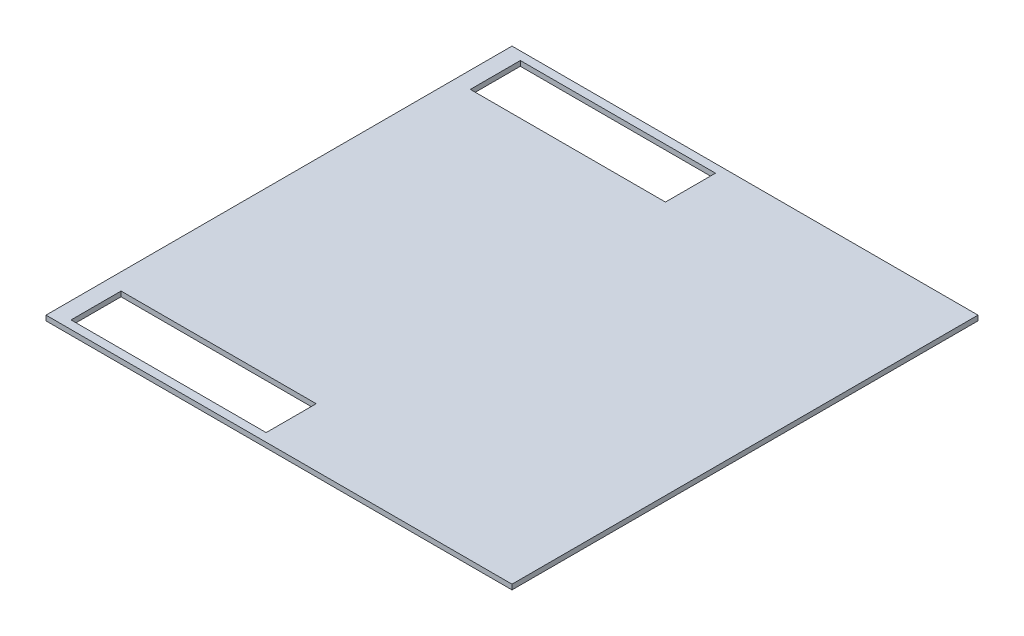
ISO-10303-21;
HEADER;
FILE_DESCRIPTION(('STEP AP214'),'2;1');
FILE_NAME('part.step','',(''),(''),'','','');
FILE_SCHEMA(('AUTOMOTIVE_DESIGN { 1 0 10303 214 1 1 1 1 }'));
ENDSEC;
DATA;
#1=APPLICATION_CONTEXT('core data for automotive mechanical design processes');
#2=APPLICATION_PROTOCOL_DEFINITION('international standard','automotive_design',2000,#1);
#3=PRODUCT_CONTEXT('',#1,'mechanical');
#4=PRODUCT('Part','Part','',(#3));
#5=PRODUCT_RELATED_PRODUCT_CATEGORY('part','',(#4));
#6=PRODUCT_DEFINITION_FORMATION('','',#4);
#7=PRODUCT_DEFINITION_CONTEXT('part definition',#1,'design');
#8=PRODUCT_DEFINITION('design','',#6,#7);
#9=PRODUCT_DEFINITION_SHAPE('','',#8);
#10=(LENGTH_UNIT() NAMED_UNIT(*) SI_UNIT(.MILLI.,.METRE.));
#11=(NAMED_UNIT(*) PLANE_ANGLE_UNIT() SI_UNIT($,.RADIAN.));
#12=(NAMED_UNIT(*) SI_UNIT($,.STERADIAN.) SOLID_ANGLE_UNIT());
#13=UNCERTAINTY_MEASURE_WITH_UNIT(LENGTH_MEASURE(1.E-05),#10,'distance_accuracy_value','');
#14=(GEOMETRIC_REPRESENTATION_CONTEXT(3) GLOBAL_UNCERTAINTY_ASSIGNED_CONTEXT((#13)) GLOBAL_UNIT_ASSIGNED_CONTEXT((#10,
#11,#12)) REPRESENTATION_CONTEXT('',''));
#15=CARTESIAN_POINT('',(0.,0.,0.));
#16=DIRECTION('',(0.,0.,1.));
#17=DIRECTION('',(1.,0.,0.));
#18=AXIS2_PLACEMENT_3D('',#15,#16,#17);
#19=CARTESIAN_POINT('',(0.,3.,0.));
#20=DIRECTION('',(0.,1.,0.));
#21=DIRECTION('',(0.,0.,1.));
#22=AXIS2_PLACEMENT_3D('',#19,#20,#21);
#23=PLANE('',#22);
#24=DIRECTION('',(0.,0.,-1.));
#25=VECTOR('',#24,1.);
#26=CARTESIAN_POINT('',(139.7,3.,-139.7));
#27=LINE('',#26,#25);
#28=CARTESIAN_POINT('',(139.7,3.,139.7));
#29=VERTEX_POINT('',#28);
#30=CARTESIAN_POINT('',(139.7,3.,-139.7));
#31=VERTEX_POINT('',#30);
#32=EDGE_CURVE('E188',#29,#31,#27,.T.);
#33=ORIENTED_EDGE('',*,*,#32,.T.);
#34=DIRECTION('',(-1.,0.,0.));
#35=VECTOR('',#34,1.);
#36=CARTESIAN_POINT('',(-139.7,3.,-139.7));
#37=LINE('',#36,#35);
#38=CARTESIAN_POINT('',(-139.7,3.,-139.7));
#39=VERTEX_POINT('',#38);
#40=EDGE_CURVE('E191',#31,#39,#37,.T.);
#41=ORIENTED_EDGE('',*,*,#40,.T.);
#42=DIRECTION('',(0.,0.,1.));
#43=VECTOR('',#42,1.);
#44=CARTESIAN_POINT('',(-139.7,3.,-139.7));
#45=LINE('',#44,#43);
#46=CARTESIAN_POINT('',(-139.7,3.,139.7));
#47=VERTEX_POINT('',#46);
#48=EDGE_CURVE('E194',#39,#47,#45,.T.);
#49=ORIENTED_EDGE('',*,*,#48,.T.);
#50=DIRECTION('',(1.,0.,0.));
#51=VECTOR('',#50,1.);
#52=CARTESIAN_POINT('',(-139.7,3.,139.7));
#53=LINE('',#52,#51);
#54=EDGE_CURVE('E196',#47,#29,#53,.T.);
#55=ORIENTED_EDGE('',*,*,#54,.T.);
#56=EDGE_LOOP('',(#33,#41,#49,#55));
#57=FACE_BOUND('',#56,.T.);
#58=DIRECTION('',(1.,0.,0.));
#59=VECTOR('',#58,1.);
#60=CARTESIAN_POINT('',(-129.7,3.,-104.7));
#61=LINE('',#60,#59);
#62=CARTESIAN_POINT('',(-129.7,3.,-104.7));
#63=VERTEX_POINT('',#62);
#64=CARTESIAN_POINT('',(-12.7000000000001,3.,-104.7));
#65=VERTEX_POINT('',#64);
#66=EDGE_CURVE('E159',#63,#65,#61,.T.);
#67=ORIENTED_EDGE('',*,*,#66,.F.);
#68=DIRECTION('',(0.,0.,1.));
#69=VECTOR('',#68,1.);
#70=CARTESIAN_POINT('',(-129.7,3.,-134.7));
#71=LINE('',#70,#69);
#72=CARTESIAN_POINT('',(-129.7,3.,-134.7));
#73=VERTEX_POINT('',#72);
#74=EDGE_CURVE('E157',#73,#63,#71,.T.);
#75=ORIENTED_EDGE('',*,*,#74,.F.);
#76=DIRECTION('',(-1.,0.,0.));
#77=VECTOR('',#76,1.);
#78=CARTESIAN_POINT('',(-129.7,3.,-134.7));
#79=LINE('',#78,#77);
#80=CARTESIAN_POINT('',(-12.7000000000001,3.,-134.7));
#81=VERTEX_POINT('',#80);
#82=EDGE_CURVE('E165',#81,#73,#79,.T.);
#83=ORIENTED_EDGE('',*,*,#82,.F.);
#84=DIRECTION('',(0.,0.,-1.));
#85=VECTOR('',#84,1.);
#86=CARTESIAN_POINT('',(-12.7000000000001,3.,-134.7));
#87=LINE('',#86,#85);
#88=EDGE_CURVE('E162',#65,#81,#87,.T.);
#89=ORIENTED_EDGE('',*,*,#88,.F.);
#90=EDGE_LOOP('',(#67,#75,#83,#89));
#91=FACE_BOUND('',#90,.T.);
#92=DIRECTION('',(1.,0.,0.));
#93=VECTOR('',#92,1.);
#94=CARTESIAN_POINT('',(-129.7,3.,134.7));
#95=LINE('',#94,#93);
#96=CARTESIAN_POINT('',(-129.7,3.,134.7));
#97=VERTEX_POINT('',#96);
#98=CARTESIAN_POINT('',(-12.7000000000001,3.,134.7));
#99=VERTEX_POINT('',#98);
#100=EDGE_CURVE('E129',#97,#99,#95,.T.);
#101=ORIENTED_EDGE('',*,*,#100,.F.);
#102=DIRECTION('',(0.,0.,1.));
#103=VECTOR('',#102,1.);
#104=CARTESIAN_POINT('',(-129.7,3.,134.7));
#105=LINE('',#104,#103);
#106=CARTESIAN_POINT('',(-129.7,3.,104.7));
#107=VERTEX_POINT('',#106);
#108=EDGE_CURVE('E121',#107,#97,#105,.T.);
#109=ORIENTED_EDGE('',*,*,#108,.F.);
#110=DIRECTION('',(-1.,0.,0.));
#111=VECTOR('',#110,1.);
#112=CARTESIAN_POINT('',(-129.7,3.,104.7));
#113=LINE('',#112,#111);
#114=CARTESIAN_POINT('',(-12.7000000000001,3.,104.7));
#115=VERTEX_POINT('',#114);
#116=EDGE_CURVE('E143',#115,#107,#113,.T.);
#117=ORIENTED_EDGE('',*,*,#116,.F.);
#118=DIRECTION('',(0.,0.,-1.));
#119=VECTOR('',#118,1.);
#120=CARTESIAN_POINT('',(-12.7000000000001,3.,134.7));
#121=LINE('',#120,#119);
#122=EDGE_CURVE('E141',#99,#115,#121,.T.);
#123=ORIENTED_EDGE('',*,*,#122,.F.);
#124=EDGE_LOOP('',(#101,#109,#117,#123));
#125=FACE_BOUND('',#124,.T.);
#126=ADVANCED_FACE('F32',(#57,#91,#125),#23,.T.);
#127=CARTESIAN_POINT('',(0.,0.,0.));
#128=DIRECTION('',(0.,1.,0.));
#129=DIRECTION('',(0.,0.,1.));
#130=AXIS2_PLACEMENT_3D('',#127,#128,#129);
#131=PLANE('',#130);
#132=DIRECTION('',(0.,0.,1.));
#133=VECTOR('',#132,1.);
#134=CARTESIAN_POINT('',(-129.7,0.,-134.7));
#135=LINE('',#134,#133);
#136=CARTESIAN_POINT('',(-129.7,0.,-134.7));
#137=VERTEX_POINT('',#136);
#138=CARTESIAN_POINT('',(-129.7,0.,-104.7));
#139=VERTEX_POINT('',#138);
#140=EDGE_CURVE('E137',#137,#139,#135,.T.);
#141=ORIENTED_EDGE('',*,*,#140,.T.);
#142=DIRECTION('',(1.,0.,0.));
#143=VECTOR('',#142,1.);
#144=CARTESIAN_POINT('',(-129.7,0.,-104.7));
#145=LINE('',#144,#143);
#146=CARTESIAN_POINT('',(-12.7000000000001,0.,-104.7));
#147=VERTEX_POINT('',#146);
#148=EDGE_CURVE('E170',#139,#147,#145,.T.);
#149=ORIENTED_EDGE('',*,*,#148,.T.);
#150=DIRECTION('',(0.,0.,-1.));
#151=VECTOR('',#150,1.);
#152=CARTESIAN_POINT('',(-12.7000000000001,0.,-134.7));
#153=LINE('',#152,#151);
#154=CARTESIAN_POINT('',(-12.7000000000001,0.,-134.7));
#155=VERTEX_POINT('',#154);
#156=EDGE_CURVE('E173',#147,#155,#153,.T.);
#157=ORIENTED_EDGE('',*,*,#156,.T.);
#158=DIRECTION('',(-1.,0.,0.));
#159=VECTOR('',#158,1.);
#160=CARTESIAN_POINT('',(-129.7,0.,-134.7));
#161=LINE('',#160,#159);
#162=EDGE_CURVE('E160',#155,#137,#161,.T.);
#163=ORIENTED_EDGE('',*,*,#162,.T.);
#164=EDGE_LOOP('',(#141,#149,#157,#163));
#165=FACE_BOUND('',#164,.T.);
#166=DIRECTION('',(0.,0.,-1.));
#167=VECTOR('',#166,1.);
#168=CARTESIAN_POINT('',(139.7,0.,-139.7));
#169=LINE('',#168,#167);
#170=CARTESIAN_POINT('',(139.7,0.,139.7));
#171=VERTEX_POINT('',#170);
#172=CARTESIAN_POINT('',(139.7,0.,-139.7));
#173=VERTEX_POINT('',#172);
#174=EDGE_CURVE('E187',#171,#173,#169,.T.);
#175=ORIENTED_EDGE('',*,*,#174,.F.);
#176=DIRECTION('',(1.,0.,0.));
#177=VECTOR('',#176,1.);
#178=CARTESIAN_POINT('',(-139.7,0.,139.7));
#179=LINE('',#178,#177);
#180=CARTESIAN_POINT('',(-139.7,0.,139.7));
#181=VERTEX_POINT('',#180);
#182=EDGE_CURVE('E192',#181,#171,#179,.T.);
#183=ORIENTED_EDGE('',*,*,#182,.F.);
#184=DIRECTION('',(0.,0.,1.));
#185=VECTOR('',#184,1.);
#186=CARTESIAN_POINT('',(-139.7,0.,-139.7));
#187=LINE('',#186,#185);
#188=CARTESIAN_POINT('',(-139.7,0.,-139.7));
#189=VERTEX_POINT('',#188);
#190=EDGE_CURVE('E203',#189,#181,#187,.T.);
#191=ORIENTED_EDGE('',*,*,#190,.F.);
#192=DIRECTION('',(-1.,0.,0.));
#193=VECTOR('',#192,1.);
#194=CARTESIAN_POINT('',(-139.7,0.,-139.7));
#195=LINE('',#194,#193);
#196=EDGE_CURVE('E201',#173,#189,#195,.T.);
#197=ORIENTED_EDGE('',*,*,#196,.F.);
#198=EDGE_LOOP('',(#175,#183,#191,#197));
#199=FACE_BOUND('',#198,.T.);
#200=DIRECTION('',(0.,0.,1.));
#201=VECTOR('',#200,1.);
#202=CARTESIAN_POINT('',(-129.7,0.,134.7));
#203=LINE('',#202,#201);
#204=CARTESIAN_POINT('',(-129.7,0.,104.7));
#205=VERTEX_POINT('',#204);
#206=CARTESIAN_POINT('',(-129.7,0.,134.7));
#207=VERTEX_POINT('',#206);
#208=EDGE_CURVE('E55',#205,#207,#203,.T.);
#209=ORIENTED_EDGE('',*,*,#208,.T.);
#210=DIRECTION('',(1.,0.,0.));
#211=VECTOR('',#210,1.);
#212=CARTESIAN_POINT('',(-129.7,0.,134.7));
#213=LINE('',#212,#211);
#214=CARTESIAN_POINT('',(-12.7000000000001,0.,134.7));
#215=VERTEX_POINT('',#214);
#216=EDGE_CURVE('E136',#207,#215,#213,.T.);
#217=ORIENTED_EDGE('',*,*,#216,.T.);
#218=DIRECTION('',(0.,0.,-1.));
#219=VECTOR('',#218,1.);
#220=CARTESIAN_POINT('',(-12.7000000000001,0.,134.7));
#221=LINE('',#220,#219);
#222=CARTESIAN_POINT('',(-12.7000000000001,0.,104.7));
#223=VERTEX_POINT('',#222);
#224=EDGE_CURVE('E149',#215,#223,#221,.T.);
#225=ORIENTED_EDGE('',*,*,#224,.T.);
#226=DIRECTION('',(-1.,0.,0.));
#227=VECTOR('',#226,1.);
#228=CARTESIAN_POINT('',(-129.7,0.,104.7));
#229=LINE('',#228,#227);
#230=EDGE_CURVE('E130',#223,#205,#229,.T.);
#231=ORIENTED_EDGE('',*,*,#230,.T.);
#232=EDGE_LOOP('',(#209,#217,#225,#231));
#233=FACE_BOUND('',#232,.T.);
#234=ADVANCED_FACE('F221',(#165,#199,#233),#131,.F.);
#235=CARTESIAN_POINT('',(139.7,3.,-139.7));
#236=DIRECTION('',(-1.,0.,0.));
#237=DIRECTION('',(0.,0.,1.));
#238=AXIS2_PLACEMENT_3D('',#235,#236,#237);
#239=PLANE('',#238);
#240=ORIENTED_EDGE('',*,*,#174,.T.);
#241=DIRECTION('',(0.,-1.,0.));
#242=VECTOR('',#241,1.);
#243=CARTESIAN_POINT('',(139.7,3.,-139.7));
#244=LINE('',#243,#242);
#245=EDGE_CURVE('E11',#31,#173,#244,.T.);
#246=ORIENTED_EDGE('',*,*,#245,.F.);
#247=ORIENTED_EDGE('',*,*,#32,.F.);
#248=DIRECTION('',(0.,-1.,0.));
#249=VECTOR('',#248,1.);
#250=CARTESIAN_POINT('',(139.7,3.,139.7));
#251=LINE('',#250,#249);
#252=EDGE_CURVE('E198',#29,#171,#251,.T.);
#253=ORIENTED_EDGE('',*,*,#252,.T.);
#254=EDGE_LOOP('',(#240,#246,#247,#253));
#255=FACE_BOUND('',#254,.T.);
#256=ADVANCED_FACE('F34',(#255),#239,.F.);
#257=CARTESIAN_POINT('',(-139.7,3.,-139.7));
#258=DIRECTION('',(0.,0.,1.));
#259=DIRECTION('',(1.,0.,0.));
#260=AXIS2_PLACEMENT_3D('',#257,#258,#259);
#261=PLANE('',#260);
#262=ORIENTED_EDGE('',*,*,#196,.T.);
#263=DIRECTION('',(0.,-1.,0.));
#264=VECTOR('',#263,1.);
#265=CARTESIAN_POINT('',(-139.7,3.,-139.7));
#266=LINE('',#265,#264);
#267=EDGE_CURVE('E40',#39,#189,#266,.T.);
#268=ORIENTED_EDGE('',*,*,#267,.F.);
#269=ORIENTED_EDGE('',*,*,#40,.F.);
#270=ORIENTED_EDGE('',*,*,#245,.T.);
#271=EDGE_LOOP('',(#262,#268,#269,#270));
#272=FACE_BOUND('',#271,.T.);
#273=ADVANCED_FACE('F232',(#272),#261,.F.);
#274=CARTESIAN_POINT('',(-139.7,3.,-139.7));
#275=DIRECTION('',(1.,0.,0.));
#276=DIRECTION('',(0.,0.,-1.));
#277=AXIS2_PLACEMENT_3D('',#274,#275,#276);
#278=PLANE('',#277);
#279=ORIENTED_EDGE('',*,*,#190,.T.);
#280=DIRECTION('',(0.,-1.,0.));
#281=VECTOR('',#280,1.);
#282=CARTESIAN_POINT('',(-139.7,3.,139.7));
#283=LINE('',#282,#281);
#284=EDGE_CURVE('E208',#47,#181,#283,.T.);
#285=ORIENTED_EDGE('',*,*,#284,.F.);
#286=ORIENTED_EDGE('',*,*,#48,.F.);
#287=ORIENTED_EDGE('',*,*,#267,.T.);
#288=EDGE_LOOP('',(#279,#285,#286,#287));
#289=FACE_BOUND('',#288,.T.);
#290=ADVANCED_FACE('F215',(#289),#278,.F.);
#291=CARTESIAN_POINT('',(-139.7,3.,139.7));
#292=DIRECTION('',(0.,0.,-1.));
#293=DIRECTION('',(-1.,0.,0.));
#294=AXIS2_PLACEMENT_3D('',#291,#292,#293);
#295=PLANE('',#294);
#296=ORIENTED_EDGE('',*,*,#182,.T.);
#297=ORIENTED_EDGE('',*,*,#252,.F.);
#298=ORIENTED_EDGE('',*,*,#54,.F.);
#299=ORIENTED_EDGE('',*,*,#284,.T.);
#300=EDGE_LOOP('',(#296,#297,#298,#299));
#301=FACE_BOUND('',#300,.T.);
#302=ADVANCED_FACE('F225',(#301),#295,.F.);
#303=CARTESIAN_POINT('',(-129.7,3.,-134.7));
#304=DIRECTION('',(1.,0.,0.));
#305=DIRECTION('',(0.,0.,-1.));
#306=AXIS2_PLACEMENT_3D('',#303,#304,#305);
#307=PLANE('',#306);
#308=ORIENTED_EDGE('',*,*,#140,.F.);
#309=DIRECTION('',(0.,-1.,0.));
#310=VECTOR('',#309,1.);
#311=CARTESIAN_POINT('',(-129.7,3.,-134.7));
#312=LINE('',#311,#310);
#313=EDGE_CURVE('E167',#73,#137,#312,.T.);
#314=ORIENTED_EDGE('',*,*,#313,.F.);
#315=ORIENTED_EDGE('',*,*,#74,.T.);
#316=DIRECTION('',(0.,-1.,0.));
#317=VECTOR('',#316,1.);
#318=CARTESIAN_POINT('',(-129.7,3.,-104.7));
#319=LINE('',#318,#317);
#320=EDGE_CURVE('E184',#63,#139,#319,.T.);
#321=ORIENTED_EDGE('',*,*,#320,.T.);
#322=EDGE_LOOP('',(#308,#314,#315,#321));
#323=FACE_BOUND('',#322,.T.);
#324=ADVANCED_FACE('F247',(#323),#307,.T.);
#325=CARTESIAN_POINT('',(-129.7,3.,-104.7));
#326=DIRECTION('',(0.,0.,-1.));
#327=DIRECTION('',(-1.,0.,0.));
#328=AXIS2_PLACEMENT_3D('',#325,#326,#327);
#329=PLANE('',#328);
#330=ORIENTED_EDGE('',*,*,#148,.F.);
#331=ORIENTED_EDGE('',*,*,#320,.F.);
#332=ORIENTED_EDGE('',*,*,#66,.T.);
#333=DIRECTION('',(0.,-1.,0.));
#334=VECTOR('',#333,1.);
#335=CARTESIAN_POINT('',(-12.7000000000001,3.,-104.7));
#336=LINE('',#335,#334);
#337=EDGE_CURVE('E182',#65,#147,#336,.T.);
#338=ORIENTED_EDGE('',*,*,#337,.T.);
#339=EDGE_LOOP('',(#330,#331,#332,#338));
#340=FACE_BOUND('',#339,.T.);
#341=ADVANCED_FACE('F254',(#340),#329,.T.);
#342=CARTESIAN_POINT('',(-12.7000000000001,3.,-134.7));
#343=DIRECTION('',(-1.,0.,0.));
#344=DIRECTION('',(0.,0.,1.));
#345=AXIS2_PLACEMENT_3D('',#342,#343,#344);
#346=PLANE('',#345);
#347=ORIENTED_EDGE('',*,*,#156,.F.);
#348=ORIENTED_EDGE('',*,*,#337,.F.);
#349=ORIENTED_EDGE('',*,*,#88,.T.);
#350=DIRECTION('',(0.,-1.,0.));
#351=VECTOR('',#350,1.);
#352=CARTESIAN_POINT('',(-12.7000000000001,3.,-134.7));
#353=LINE('',#352,#351);
#354=EDGE_CURVE('E180',#81,#155,#353,.T.);
#355=ORIENTED_EDGE('',*,*,#354,.T.);
#356=EDGE_LOOP('',(#347,#348,#349,#355));
#357=FACE_BOUND('',#356,.T.);
#358=ADVANCED_FACE('F259',(#357),#346,.T.);
#359=CARTESIAN_POINT('',(-129.7,3.,-134.7));
#360=DIRECTION('',(0.,0.,1.));
#361=DIRECTION('',(1.,0.,0.));
#362=AXIS2_PLACEMENT_3D('',#359,#360,#361);
#363=PLANE('',#362);
#364=ORIENTED_EDGE('',*,*,#162,.F.);
#365=ORIENTED_EDGE('',*,*,#354,.F.);
#366=ORIENTED_EDGE('',*,*,#82,.T.);
#367=ORIENTED_EDGE('',*,*,#313,.T.);
#368=EDGE_LOOP('',(#364,#365,#366,#367));
#369=FACE_BOUND('',#368,.T.);
#370=ADVANCED_FACE('F266',(#369),#363,.T.);
#371=CARTESIAN_POINT('',(-129.7,3.,134.7));
#372=DIRECTION('',(1.,0.,0.));
#373=DIRECTION('',(0.,0.,-1.));
#374=AXIS2_PLACEMENT_3D('',#371,#372,#373);
#375=PLANE('',#374);
#376=ORIENTED_EDGE('',*,*,#208,.F.);
#377=DIRECTION('',(0.,-1.,0.));
#378=VECTOR('',#377,1.);
#379=CARTESIAN_POINT('',(-129.7,3.,104.7));
#380=LINE('',#379,#378);
#381=EDGE_CURVE('E125',#107,#205,#380,.T.);
#382=ORIENTED_EDGE('',*,*,#381,.F.);
#383=ORIENTED_EDGE('',*,*,#108,.T.);
#384=DIRECTION('',(0.,-1.,0.));
#385=VECTOR('',#384,1.);
#386=CARTESIAN_POINT('',(-129.7,3.,134.7));
#387=LINE('',#386,#385);
#388=EDGE_CURVE('E124',#97,#207,#387,.T.);
#389=ORIENTED_EDGE('',*,*,#388,.T.);
#390=EDGE_LOOP('',(#376,#382,#383,#389));
#391=FACE_BOUND('',#390,.T.);
#392=ADVANCED_FACE('F123',(#391),#375,.T.);
#393=CARTESIAN_POINT('',(-129.7,3.,134.7));
#394=DIRECTION('',(0.,0.,-1.));
#395=DIRECTION('',(-1.,0.,0.));
#396=AXIS2_PLACEMENT_3D('',#393,#394,#395);
#397=PLANE('',#396);
#398=ORIENTED_EDGE('',*,*,#216,.F.);
#399=ORIENTED_EDGE('',*,*,#388,.F.);
#400=ORIENTED_EDGE('',*,*,#100,.T.);
#401=DIRECTION('',(0.,-1.,0.));
#402=VECTOR('',#401,1.);
#403=CARTESIAN_POINT('',(-12.7000000000001,3.,134.7));
#404=LINE('',#403,#402);
#405=EDGE_CURVE('E138',#99,#215,#404,.T.);
#406=ORIENTED_EDGE('',*,*,#405,.T.);
#407=EDGE_LOOP('',(#398,#399,#400,#406));
#408=FACE_BOUND('',#407,.T.);
#409=ADVANCED_FACE('F133',(#408),#397,.T.);
#410=CARTESIAN_POINT('',(-12.7000000000001,3.,134.7));
#411=DIRECTION('',(-1.,0.,0.));
#412=DIRECTION('',(0.,0.,1.));
#413=AXIS2_PLACEMENT_3D('',#410,#411,#412);
#414=PLANE('',#413);
#415=ORIENTED_EDGE('',*,*,#224,.F.);
#416=ORIENTED_EDGE('',*,*,#405,.F.);
#417=ORIENTED_EDGE('',*,*,#122,.T.);
#418=DIRECTION('',(0.,-1.,0.));
#419=VECTOR('',#418,1.);
#420=CARTESIAN_POINT('',(-12.7000000000001,3.,104.7));
#421=LINE('',#420,#419);
#422=EDGE_CURVE('E47',#115,#223,#421,.T.);
#423=ORIENTED_EDGE('',*,*,#422,.T.);
#424=EDGE_LOOP('',(#415,#416,#417,#423));
#425=FACE_BOUND('',#424,.T.);
#426=ADVANCED_FACE('F284',(#425),#414,.T.);
#427=CARTESIAN_POINT('',(-129.7,3.,104.7));
#428=DIRECTION('',(0.,0.,1.));
#429=DIRECTION('',(1.,0.,0.));
#430=AXIS2_PLACEMENT_3D('',#427,#428,#429);
#431=PLANE('',#430);
#432=ORIENTED_EDGE('',*,*,#230,.F.);
#433=ORIENTED_EDGE('',*,*,#422,.F.);
#434=ORIENTED_EDGE('',*,*,#116,.T.);
#435=ORIENTED_EDGE('',*,*,#381,.T.);
#436=EDGE_LOOP('',(#432,#433,#434,#435));
#437=FACE_BOUND('',#436,.T.);
#438=ADVANCED_FACE('F287',(#437),#431,.T.);
#439=CLOSED_SHELL('',(#126,#234,#256,#273,#290,#302,#324,#341,#358,#370,#392,#409,#426,#438));
#440=MANIFOLD_SOLID_BREP('B2',#439);
#441=ADVANCED_BREP_SHAPE_REPRESENTATION('',(#18,#440),#14);
#442=SHAPE_DEFINITION_REPRESENTATION(#9,#441);
ENDSEC;
END-ISO-10303-21;
